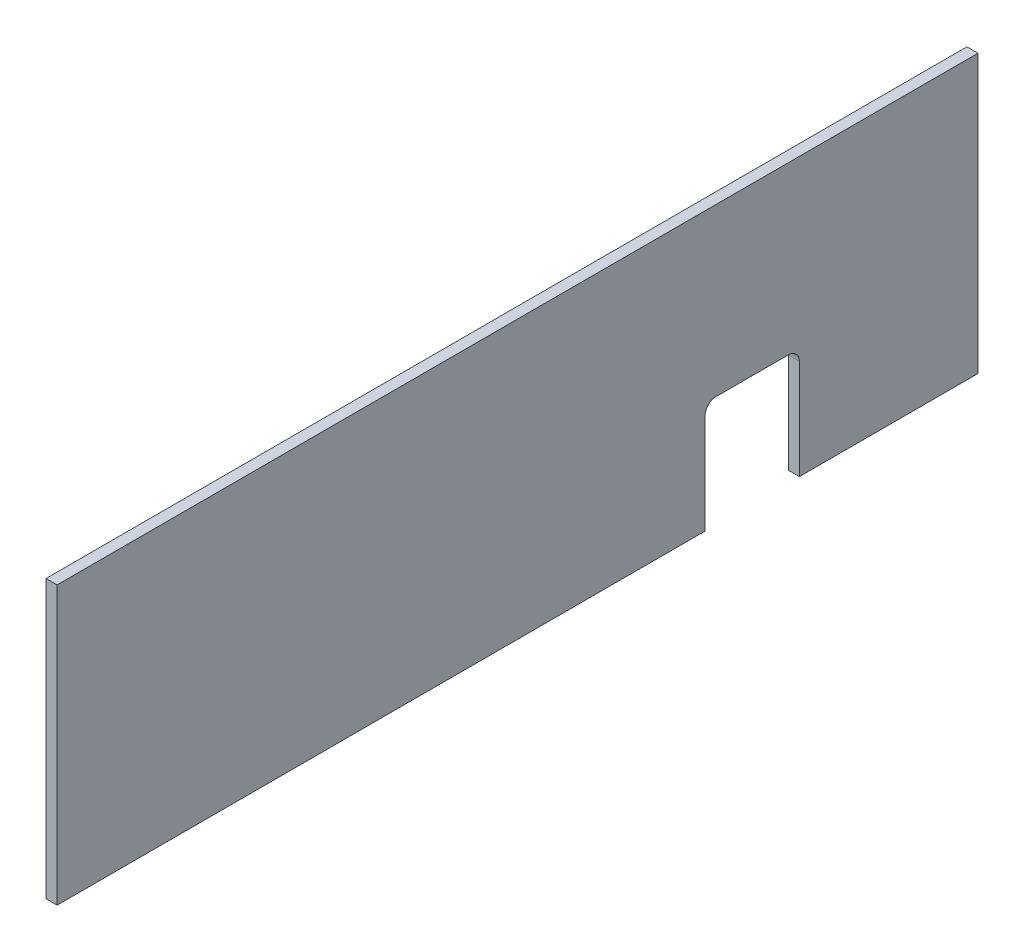
ISO-10303-21;
HEADER;
FILE_DESCRIPTION(('STEP AP214'),'2;1');
FILE_NAME('part.step','',(''),(''),'','','');
FILE_SCHEMA(('AUTOMOTIVE_DESIGN { 1 0 10303 214 1 1 1 1 }'));
ENDSEC;
DATA;
#1=APPLICATION_CONTEXT('core data for automotive mechanical design processes');
#2=APPLICATION_PROTOCOL_DEFINITION('international standard','automotive_design',2000,#1);
#3=PRODUCT_CONTEXT('',#1,'mechanical');
#4=PRODUCT('Part','Part','',(#3));
#5=PRODUCT_RELATED_PRODUCT_CATEGORY('part','',(#4));
#6=PRODUCT_DEFINITION_FORMATION('','',#4);
#7=PRODUCT_DEFINITION_CONTEXT('part definition',#1,'design');
#8=PRODUCT_DEFINITION('design','',#6,#7);
#9=PRODUCT_DEFINITION_SHAPE('','',#8);
#10=(LENGTH_UNIT() NAMED_UNIT(*) SI_UNIT(.MILLI.,.METRE.));
#11=(NAMED_UNIT(*) PLANE_ANGLE_UNIT() SI_UNIT($,.RADIAN.));
#12=(NAMED_UNIT(*) SI_UNIT($,.STERADIAN.) SOLID_ANGLE_UNIT());
#13=UNCERTAINTY_MEASURE_WITH_UNIT(LENGTH_MEASURE(1.E-05),#10,'distance_accuracy_value','');
#14=(GEOMETRIC_REPRESENTATION_CONTEXT(3) GLOBAL_UNCERTAINTY_ASSIGNED_CONTEXT((#13)) GLOBAL_UNIT_ASSIGNED_CONTEXT((#10,
#11,#12)) REPRESENTATION_CONTEXT('',''));
#15=CARTESIAN_POINT('',(0.,0.,0.));
#16=DIRECTION('',(0.,0.,1.));
#17=DIRECTION('',(1.,0.,0.));
#18=AXIS2_PLACEMENT_3D('',#15,#16,#17);
#19=CARTESIAN_POINT('',(1.,0.,-25.4));
#20=DIRECTION('',(0.,0.,1.));
#21=DIRECTION('',(1.,0.,0.));
#22=AXIS2_PLACEMENT_3D('',#19,#20,#21);
#23=PLANE('',#22);
#24=DIRECTION('',(0.,1.,0.));
#25=VECTOR('',#24,1.);
#26=CARTESIAN_POINT('',(1.,0.,-25.4));
#27=LINE('',#26,#25);
#28=CARTESIAN_POINT('',(1.,-12.5,-25.4));
#29=VERTEX_POINT('',#28);
#30=CARTESIAN_POINT('',(1.,-3.5,-25.4));
#31=VERTEX_POINT('',#30);
#32=EDGE_CURVE('E111',#29,#31,#27,.T.);
#33=ORIENTED_EDGE('',*,*,#32,.T.);
#34=DIRECTION('',(-1.,0.,0.));
#35=VECTOR('',#34,1.);
#36=CARTESIAN_POINT('',(1.,-3.5,-25.4));
#37=LINE('',#36,#35);
#38=CARTESIAN_POINT('',(0.,-3.5,-25.4));
#39=VERTEX_POINT('',#38);
#40=EDGE_CURVE('E177',#31,#39,#37,.T.);
#41=ORIENTED_EDGE('',*,*,#40,.T.);
#42=DIRECTION('',(0.,1.,0.));
#43=VECTOR('',#42,1.);
#44=CARTESIAN_POINT('',(0.,0.,-25.4));
#45=LINE('',#44,#43);
#46=CARTESIAN_POINT('',(0.,-12.5,-25.4));
#47=VERTEX_POINT('',#46);
#48=EDGE_CURVE('E113',#47,#39,#45,.T.);
#49=ORIENTED_EDGE('',*,*,#48,.F.);
#50=DIRECTION('',(-1.,0.,0.));
#51=VECTOR('',#50,1.);
#52=CARTESIAN_POINT('',(1.,-12.5,-25.4));
#53=LINE('',#52,#51);
#54=EDGE_CURVE('E109',#29,#47,#53,.T.);
#55=ORIENTED_EDGE('',*,*,#54,.F.);
#56=EDGE_LOOP('',(#33,#41,#49,#55));
#57=FACE_BOUND('',#56,.T.);
#58=ADVANCED_FACE('F33',(#57),#23,.T.);
#59=CARTESIAN_POINT('',(1.,-12.5,0.));
#60=DIRECTION('',(0.,1.,0.));
#61=DIRECTION('',(0.,0.,1.));
#62=AXIS2_PLACEMENT_3D('',#59,#60,#61);
#63=PLANE('',#62);
#64=DIRECTION('',(0.,0.,-1.));
#65=VECTOR('',#64,1.);
#66=CARTESIAN_POINT('',(0.,-12.5,0.));
#67=LINE('',#66,#65);
#68=CARTESIAN_POINT('',(0.,-12.5,-41.5));
#69=VERTEX_POINT('',#68);
#70=EDGE_CURVE('E148',#47,#69,#67,.T.);
#71=ORIENTED_EDGE('',*,*,#70,.T.);
#72=DIRECTION('',(-1.,0.,0.));
#73=VECTOR('',#72,1.);
#74=CARTESIAN_POINT('',(1.,-12.5,-41.5));
#75=LINE('',#74,#73);
#76=CARTESIAN_POINT('',(1.,-12.5,-41.5));
#77=VERTEX_POINT('',#76);
#78=EDGE_CURVE('E117',#77,#69,#75,.T.);
#79=ORIENTED_EDGE('',*,*,#78,.F.);
#80=DIRECTION('',(0.,0.,-1.));
#81=VECTOR('',#80,1.);
#82=CARTESIAN_POINT('',(1.,-12.5,0.));
#83=LINE('',#82,#81);
#84=EDGE_CURVE('E120',#29,#77,#83,.T.);
#85=ORIENTED_EDGE('',*,*,#84,.F.);
#86=ORIENTED_EDGE('',*,*,#54,.T.);
#87=EDGE_LOOP('',(#71,#79,#85,#86));
#88=FACE_BOUND('',#87,.T.);
#89=ADVANCED_FACE('F121',(#88),#63,.F.);
#90=CARTESIAN_POINT('',(1.,0.,-41.5));
#91=DIRECTION('',(0.,0.,1.));
#92=DIRECTION('',(1.,0.,0.));
#93=AXIS2_PLACEMENT_3D('',#90,#91,#92);
#94=PLANE('',#93);
#95=DIRECTION('',(0.,1.,0.));
#96=VECTOR('',#95,1.);
#97=CARTESIAN_POINT('',(0.,0.,-41.5));
#98=LINE('',#97,#96);
#99=CARTESIAN_POINT('',(0.,12.5,-41.5));
#100=VERTEX_POINT('',#99);
#101=EDGE_CURVE('E150',#69,#100,#98,.T.);
#102=ORIENTED_EDGE('',*,*,#101,.T.);
#103=DIRECTION('',(-1.,0.,0.));
#104=VECTOR('',#103,1.);
#105=CARTESIAN_POINT('',(1.,12.5,-41.5));
#106=LINE('',#105,#104);
#107=CARTESIAN_POINT('',(1.,12.5,-41.5));
#108=VERTEX_POINT('',#107);
#109=EDGE_CURVE('E168',#108,#100,#106,.T.);
#110=ORIENTED_EDGE('',*,*,#109,.F.);
#111=DIRECTION('',(0.,1.,0.));
#112=VECTOR('',#111,1.);
#113=CARTESIAN_POINT('',(1.,0.,-41.5));
#114=LINE('',#113,#112);
#115=EDGE_CURVE('E124',#77,#108,#114,.T.);
#116=ORIENTED_EDGE('',*,*,#115,.F.);
#117=ORIENTED_EDGE('',*,*,#78,.T.);
#118=EDGE_LOOP('',(#102,#110,#116,#117));
#119=FACE_BOUND('',#118,.T.);
#120=ADVANCED_FACE('F202',(#119),#94,.F.);
#121=CARTESIAN_POINT('',(1.,12.5,0.));
#122=DIRECTION('',(0.,1.,0.));
#123=DIRECTION('',(0.,0.,1.));
#124=AXIS2_PLACEMENT_3D('',#121,#122,#123);
#125=PLANE('',#124);
#126=DIRECTION('',(0.,0.,-1.));
#127=VECTOR('',#126,1.);
#128=CARTESIAN_POINT('',(0.,12.5,0.));
#129=LINE('',#128,#127);
#130=CARTESIAN_POINT('',(0.,12.5,41.5));
#131=VERTEX_POINT('',#130);
#132=EDGE_CURVE('E154',#131,#100,#129,.T.);
#133=ORIENTED_EDGE('',*,*,#132,.F.);
#134=DIRECTION('',(-1.,0.,0.));
#135=VECTOR('',#134,1.);
#136=CARTESIAN_POINT('',(1.,12.5,41.5));
#137=LINE('',#136,#135);
#138=CARTESIAN_POINT('',(1.,12.5,41.5));
#139=VERTEX_POINT('',#138);
#140=EDGE_CURVE('E166',#139,#131,#137,.T.);
#141=ORIENTED_EDGE('',*,*,#140,.F.);
#142=DIRECTION('',(0.,0.,-1.));
#143=VECTOR('',#142,1.);
#144=CARTESIAN_POINT('',(1.,12.5,0.));
#145=LINE('',#144,#143);
#146=EDGE_CURVE('E135',#139,#108,#145,.T.);
#147=ORIENTED_EDGE('',*,*,#146,.T.);
#148=ORIENTED_EDGE('',*,*,#109,.T.);
#149=EDGE_LOOP('',(#133,#141,#147,#148));
#150=FACE_BOUND('',#149,.T.);
#151=ADVANCED_FACE('F208',(#150),#125,.T.);
#152=CARTESIAN_POINT('',(1.,0.,41.5));
#153=DIRECTION('',(0.,0.,1.));
#154=DIRECTION('',(1.,0.,0.));
#155=AXIS2_PLACEMENT_3D('',#152,#153,#154);
#156=PLANE('',#155);
#157=DIRECTION('',(0.,1.,0.));
#158=VECTOR('',#157,1.);
#159=CARTESIAN_POINT('',(0.,0.,41.5));
#160=LINE('',#159,#158);
#161=CARTESIAN_POINT('',(0.,-12.5,41.5));
#162=VERTEX_POINT('',#161);
#163=EDGE_CURVE('E157',#162,#131,#160,.T.);
#164=ORIENTED_EDGE('',*,*,#163,.F.);
#165=DIRECTION('',(-1.,0.,0.));
#166=VECTOR('',#165,1.);
#167=CARTESIAN_POINT('',(1.,-12.5,41.5));
#168=LINE('',#167,#166);
#169=CARTESIAN_POINT('',(1.,-12.5,41.5));
#170=VERTEX_POINT('',#169);
#171=EDGE_CURVE('E164',#170,#162,#168,.T.);
#172=ORIENTED_EDGE('',*,*,#171,.F.);
#173=DIRECTION('',(0.,1.,0.));
#174=VECTOR('',#173,1.);
#175=CARTESIAN_POINT('',(1.,0.,41.5));
#176=LINE('',#175,#174);
#177=EDGE_CURVE('E138',#170,#139,#176,.T.);
#178=ORIENTED_EDGE('',*,*,#177,.T.);
#179=ORIENTED_EDGE('',*,*,#140,.T.);
#180=EDGE_LOOP('',(#164,#172,#178,#179));
#181=FACE_BOUND('',#180,.T.);
#182=ADVANCED_FACE('F212',(#181),#156,.T.);
#183=CARTESIAN_POINT('',(0.,-12.5,-16.9));
#184=VERTEX_POINT('',#183);
#185=EDGE_CURVE('E151',#162,#184,#67,.T.);
#186=ORIENTED_EDGE('',*,*,#185,.T.);
#187=DIRECTION('',(-1.,0.,0.));
#188=VECTOR('',#187,1.);
#189=CARTESIAN_POINT('',(1.,-12.5,-16.9));
#190=LINE('',#189,#188);
#191=CARTESIAN_POINT('',(1.,-12.5,-16.9));
#192=VERTEX_POINT('',#191);
#193=EDGE_CURVE('E146',#192,#184,#190,.T.);
#194=ORIENTED_EDGE('',*,*,#193,.F.);
#195=EDGE_CURVE('E126',#170,#192,#83,.T.);
#196=ORIENTED_EDGE('',*,*,#195,.F.);
#197=ORIENTED_EDGE('',*,*,#171,.T.);
#198=EDGE_LOOP('',(#186,#194,#196,#197));
#199=FACE_BOUND('',#198,.T.);
#200=ADVANCED_FACE('F204',(#199),#63,.F.);
#201=CARTESIAN_POINT('',(1.,0.,-16.9));
#202=DIRECTION('',(0.,0.,1.));
#203=DIRECTION('',(1.,0.,0.));
#204=AXIS2_PLACEMENT_3D('',#201,#202,#203);
#205=PLANE('',#204);
#206=DIRECTION('',(0.,1.,0.));
#207=VECTOR('',#206,1.);
#208=CARTESIAN_POINT('',(0.,0.,-16.9));
#209=LINE('',#208,#207);
#210=CARTESIAN_POINT('',(0.,-3.5,-16.9));
#211=VERTEX_POINT('',#210);
#212=EDGE_CURVE('E131',#184,#211,#209,.T.);
#213=ORIENTED_EDGE('',*,*,#212,.T.);
#214=DIRECTION('',(-1.,0.,0.));
#215=VECTOR('',#214,1.);
#216=CARTESIAN_POINT('',(1.,-3.5,-16.9));
#217=LINE('',#216,#215);
#218=CARTESIAN_POINT('',(1.,-3.5,-16.9));
#219=VERTEX_POINT('',#218);
#220=EDGE_CURVE('E175',#211,#219,#217,.F.);
#221=ORIENTED_EDGE('',*,*,#220,.T.);
#222=DIRECTION('',(0.,1.,0.));
#223=VECTOR('',#222,1.);
#224=CARTESIAN_POINT('',(1.,0.,-16.9));
#225=LINE('',#224,#223);
#226=EDGE_CURVE('E141',#192,#219,#225,.T.);
#227=ORIENTED_EDGE('',*,*,#226,.F.);
#228=ORIENTED_EDGE('',*,*,#193,.T.);
#229=EDGE_LOOP('',(#213,#221,#227,#228));
#230=FACE_BOUND('',#229,.T.);
#231=ADVANCED_FACE('F218',(#230),#205,.F.);
#232=CARTESIAN_POINT('',(1.,-2.5,0.));
#233=DIRECTION('',(0.,1.,0.));
#234=DIRECTION('',(0.,0.,1.));
#235=AXIS2_PLACEMENT_3D('',#232,#233,#234);
#236=PLANE('',#235);
#237=DIRECTION('',(0.,0.,-1.));
#238=VECTOR('',#237,1.);
#239=CARTESIAN_POINT('',(1.,-2.5,0.));
#240=LINE('',#239,#238);
#241=CARTESIAN_POINT('',(1.,-2.5,-17.9));
#242=VERTEX_POINT('',#241);
#243=CARTESIAN_POINT('',(1.,-2.5,-24.4));
#244=VERTEX_POINT('',#243);
#245=EDGE_CURVE('E144',#242,#244,#240,.T.);
#246=ORIENTED_EDGE('',*,*,#245,.F.);
#247=DIRECTION('',(-1.,0.,0.));
#248=VECTOR('',#247,1.);
#249=CARTESIAN_POINT('',(0.,-2.5,-17.9));
#250=LINE('',#249,#248);
#251=CARTESIAN_POINT('',(0.,-2.5,-17.9));
#252=VERTEX_POINT('',#251);
#253=EDGE_CURVE('E172',#242,#252,#250,.T.);
#254=ORIENTED_EDGE('',*,*,#253,.T.);
#255=DIRECTION('',(0.,0.,-1.));
#256=VECTOR('',#255,1.);
#257=CARTESIAN_POINT('',(0.,-2.5,0.));
#258=LINE('',#257,#256);
#259=CARTESIAN_POINT('',(0.,-2.5,-24.4));
#260=VERTEX_POINT('',#259);
#261=EDGE_CURVE('E128',#252,#260,#258,.T.);
#262=ORIENTED_EDGE('',*,*,#261,.T.);
#263=DIRECTION('',(-1.,0.,0.));
#264=VECTOR('',#263,1.);
#265=CARTESIAN_POINT('',(1.,-2.5,-24.4));
#266=LINE('',#265,#264);
#267=EDGE_CURVE('E116',#260,#244,#266,.F.);
#268=ORIENTED_EDGE('',*,*,#267,.T.);
#269=EDGE_LOOP('',(#246,#254,#262,#268));
#270=FACE_BOUND('',#269,.T.);
#271=ADVANCED_FACE('F187',(#270),#236,.F.);
#272=CARTESIAN_POINT('',(1.,0.,0.));
#273=DIRECTION('',(1.,0.,0.));
#274=DIRECTION('',(0.,0.,-1.));
#275=AXIS2_PLACEMENT_3D('',#272,#273,#274);
#276=PLANE('',#275);
#277=ORIENTED_EDGE('',*,*,#32,.F.);
#278=ORIENTED_EDGE('',*,*,#84,.T.);
#279=ORIENTED_EDGE('',*,*,#115,.T.);
#280=ORIENTED_EDGE('',*,*,#146,.F.);
#281=ORIENTED_EDGE('',*,*,#177,.F.);
#282=ORIENTED_EDGE('',*,*,#195,.T.);
#283=ORIENTED_EDGE('',*,*,#226,.T.);
#284=CARTESIAN_POINT('',(1.,-3.5,-17.9));
#285=DIRECTION('',(1.,0.,0.));
#286=DIRECTION('',(0.,0.,-1.));
#287=AXIS2_PLACEMENT_3D('',#284,#285,#286);
#288=CIRCLE('',#287,1.);
#289=EDGE_CURVE('E181',#219,#242,#288,.F.);
#290=ORIENTED_EDGE('',*,*,#289,.T.);
#291=ORIENTED_EDGE('',*,*,#245,.T.);
#292=CARTESIAN_POINT('',(1.,-3.5,-24.4));
#293=DIRECTION('',(1.,0.,0.));
#294=DIRECTION('',(0.,0.,-1.));
#295=AXIS2_PLACEMENT_3D('',#292,#293,#294);
#296=CIRCLE('',#295,1.);
#297=EDGE_CURVE('E11',#244,#31,#296,.F.);
#298=ORIENTED_EDGE('',*,*,#297,.T.);
#299=EDGE_LOOP('',(#277,#278,#279,#280,#281,#282,#283,#290,#291,#298));
#300=FACE_BOUND('',#299,.T.);
#301=ADVANCED_FACE('F127',(#300),#276,.T.);
#302=CARTESIAN_POINT('',(0.,0.,0.));
#303=DIRECTION('',(1.,0.,0.));
#304=DIRECTION('',(0.,0.,-1.));
#305=AXIS2_PLACEMENT_3D('',#302,#303,#304);
#306=PLANE('',#305);
#307=ORIENTED_EDGE('',*,*,#48,.T.);
#308=CARTESIAN_POINT('',(0.,-3.5,-24.4));
#309=DIRECTION('',(1.,0.,0.));
#310=DIRECTION('',(0.,0.,-1.));
#311=AXIS2_PLACEMENT_3D('',#308,#309,#310);
#312=CIRCLE('',#311,1.);
#313=EDGE_CURVE('E41',#39,#260,#312,.T.);
#314=ORIENTED_EDGE('',*,*,#313,.T.);
#315=ORIENTED_EDGE('',*,*,#261,.F.);
#316=CARTESIAN_POINT('',(0.,-3.5,-17.9));
#317=DIRECTION('',(1.,0.,0.));
#318=DIRECTION('',(0.,0.,-1.));
#319=AXIS2_PLACEMENT_3D('',#316,#317,#318);
#320=CIRCLE('',#319,1.);
#321=EDGE_CURVE('E179',#252,#211,#320,.T.);
#322=ORIENTED_EDGE('',*,*,#321,.T.);
#323=ORIENTED_EDGE('',*,*,#212,.F.);
#324=ORIENTED_EDGE('',*,*,#185,.F.);
#325=ORIENTED_EDGE('',*,*,#163,.T.);
#326=ORIENTED_EDGE('',*,*,#132,.T.);
#327=ORIENTED_EDGE('',*,*,#101,.F.);
#328=ORIENTED_EDGE('',*,*,#70,.F.);
#329=EDGE_LOOP('',(#307,#314,#315,#322,#323,#324,#325,#326,#327,#328));
#330=FACE_BOUND('',#329,.T.);
#331=ADVANCED_FACE('F184',(#330),#306,.F.);
#332=CARTESIAN_POINT('',(1.,-3.5,-17.9));
#333=DIRECTION('',(1.,0.,0.));
#334=DIRECTION('',(0.,0.,-1.));
#335=AXIS2_PLACEMENT_3D('',#332,#333,#334);
#336=CYLINDRICAL_SURFACE('',#335,1.);
#337=ORIENTED_EDGE('',*,*,#289,.F.);
#338=ORIENTED_EDGE('',*,*,#220,.F.);
#339=ORIENTED_EDGE('',*,*,#321,.F.);
#340=ORIENTED_EDGE('',*,*,#253,.F.);
#341=EDGE_LOOP('',(#337,#338,#339,#340));
#342=FACE_BOUND('',#341,.T.);
#343=ADVANCED_FACE('F190',(#342),#336,.F.);
#344=CARTESIAN_POINT('',(1.,-3.5,-24.4));
#345=DIRECTION('',(-1.,0.,0.));
#346=DIRECTION('',(0.,0.,1.));
#347=AXIS2_PLACEMENT_3D('',#344,#345,#346);
#348=CYLINDRICAL_SURFACE('',#347,1.);
#349=ORIENTED_EDGE('',*,*,#297,.F.);
#350=ORIENTED_EDGE('',*,*,#267,.F.);
#351=ORIENTED_EDGE('',*,*,#313,.F.);
#352=ORIENTED_EDGE('',*,*,#40,.F.);
#353=EDGE_LOOP('',(#349,#350,#351,#352));
#354=FACE_BOUND('',#353,.T.);
#355=ADVANCED_FACE('F35',(#354),#348,.F.);
#356=CLOSED_SHELL('',(#58,#89,#120,#151,#182,#200,#231,#271,#301,#331,#343,#355));
#357=MANIFOLD_SOLID_BREP('B2',#356);
#358=ADVANCED_BREP_SHAPE_REPRESENTATION('',(#18,#357),#14);
#359=SHAPE_DEFINITION_REPRESENTATION(#9,#358);
ENDSEC;
END-ISO-10303-21;
